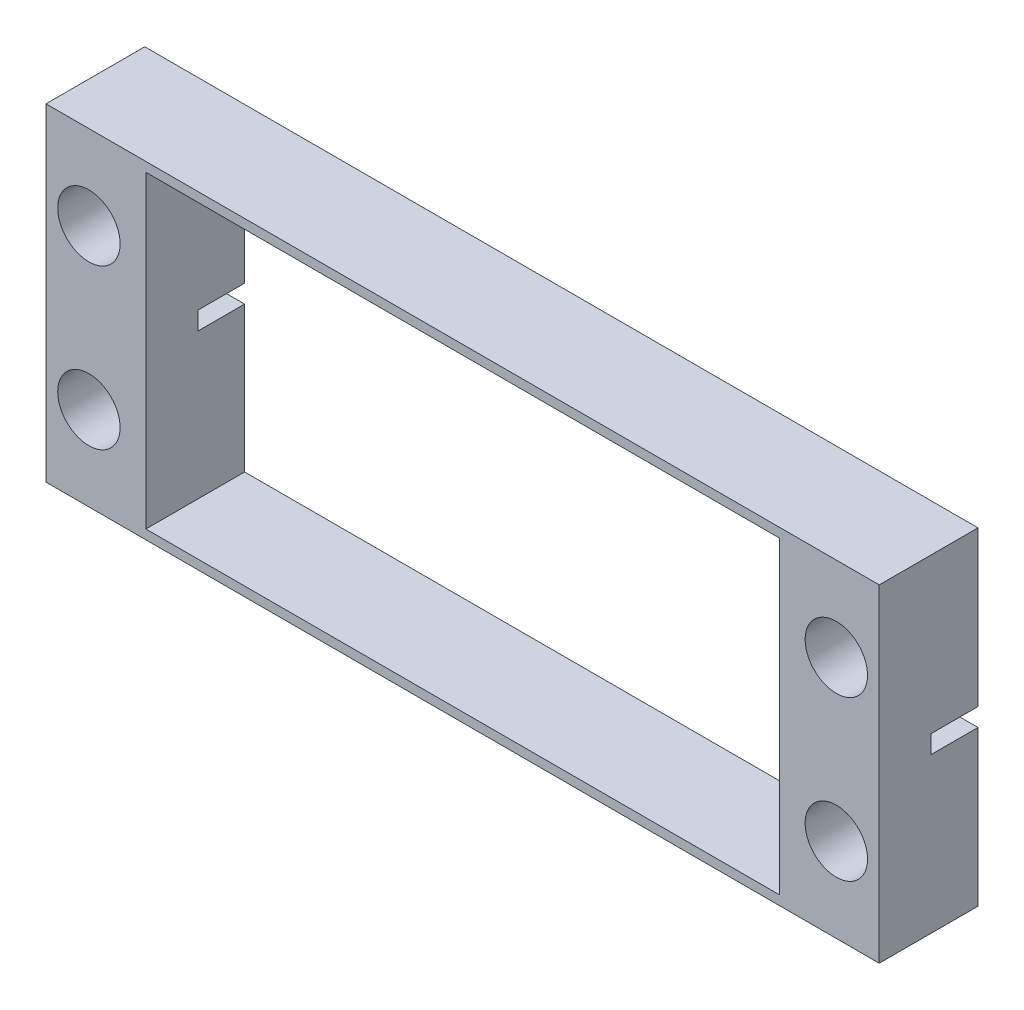
ISO-10303-21;
HEADER;
FILE_DESCRIPTION(('STEP AP214'),'2;1');
FILE_NAME('part.step','',(''),(''),'','','');
FILE_SCHEMA(('AUTOMOTIVE_DESIGN { 1 0 10303 214 1 1 1 1 }'));
ENDSEC;
DATA;
#1=APPLICATION_CONTEXT('core data for automotive mechanical design processes');
#2=APPLICATION_PROTOCOL_DEFINITION('international standard','automotive_design',2000,#1);
#3=PRODUCT_CONTEXT('',#1,'mechanical');
#4=PRODUCT('Part','Part','',(#3));
#5=PRODUCT_RELATED_PRODUCT_CATEGORY('part','',(#4));
#6=PRODUCT_DEFINITION_FORMATION('','',#4);
#7=PRODUCT_DEFINITION_CONTEXT('part definition',#1,'design');
#8=PRODUCT_DEFINITION('design','',#6,#7);
#9=PRODUCT_DEFINITION_SHAPE('','',#8);
#10=(LENGTH_UNIT() NAMED_UNIT(*) SI_UNIT(.MILLI.,.METRE.));
#11=(NAMED_UNIT(*) PLANE_ANGLE_UNIT() SI_UNIT($,.RADIAN.));
#12=(NAMED_UNIT(*) SI_UNIT($,.STERADIAN.) SOLID_ANGLE_UNIT());
#13=UNCERTAINTY_MEASURE_WITH_UNIT(LENGTH_MEASURE(1.E-05),#10,'distance_accuracy_value','');
#14=(GEOMETRIC_REPRESENTATION_CONTEXT(3) GLOBAL_UNCERTAINTY_ASSIGNED_CONTEXT((#13)) GLOBAL_UNIT_ASSIGNED_CONTEXT((#10,
#11,#12)) REPRESENTATION_CONTEXT('',''));
#15=CARTESIAN_POINT('',(0.,0.,0.));
#16=DIRECTION('',(0.,0.,1.));
#17=DIRECTION('',(1.,0.,0.));
#18=AXIS2_PLACEMENT_3D('',#15,#16,#17);
#19=CARTESIAN_POINT('',(0.,0.,0.));
#20=DIRECTION('',(0.,0.,-1.));
#21=DIRECTION('',(-1.,0.,0.));
#22=AXIS2_PLACEMENT_3D('',#19,#20,#21);
#23=PLANE('',#22);
#24=CARTESIAN_POINT('',(23.95,5.1,4.00000007075296E-08));
#25=DIRECTION('',(0.,0.,1.));
#26=DIRECTION('',(-1.,0.,0.));
#27=AXIS2_PLACEMENT_3D('',#24,#25,#26);
#28=CIRCLE('',#27,2.);
#29=CARTESIAN_POINT('',(21.95,5.1,4.00000007075296E-08));
#30=VERTEX_POINT('',#29);
#31=EDGE_CURVE('E496',#30,#30,#28,.T.);
#32=ORIENTED_EDGE('',*,*,#31,.T.);
#33=EDGE_LOOP('',(#32));
#34=FACE_BOUND('',#33,.T.);
#35=CARTESIAN_POINT('',(-23.95,5.1,4.00000007075296E-08));
#36=DIRECTION('',(0.,0.,1.));
#37=DIRECTION('',(1.,0.,0.));
#38=AXIS2_PLACEMENT_3D('',#35,#36,#37);
#39=CIRCLE('',#38,2.);
#40=CARTESIAN_POINT('',(-21.95,5.1,4.00000007075296E-08));
#41=VERTEX_POINT('',#40);
#42=EDGE_CURVE('E302',#41,#41,#39,.T.);
#43=ORIENTED_EDGE('',*,*,#42,.T.);
#44=EDGE_LOOP('',(#43));
#45=FACE_BOUND('',#44,.T.);
#46=DIRECTION('',(-1.,0.,0.));
#47=VECTOR('',#46,1.);
#48=CARTESIAN_POINT('',(26.7,0.58,0.));
#49=LINE('',#48,#47);
#50=CARTESIAN_POINT('',(-20.3,0.58,0.));
#51=VERTEX_POINT('',#50);
#52=CARTESIAN_POINT('',(-26.7,0.58,0.));
#53=VERTEX_POINT('',#52);
#54=EDGE_CURVE('E215',#51,#53,#49,.T.);
#55=ORIENTED_EDGE('',*,*,#54,.T.);
#56=DIRECTION('',(0.,-1.,0.));
#57=VECTOR('',#56,1.);
#58=CARTESIAN_POINT('',(-26.7,-10.5,0.));
#59=LINE('',#58,#57);
#60=CARTESIAN_POINT('',(-26.7,10.5,0.));
#61=VERTEX_POINT('',#60);
#62=EDGE_CURVE('E180',#61,#53,#59,.T.);
#63=ORIENTED_EDGE('',*,*,#62,.F.);
#64=DIRECTION('',(-1.,0.,0.));
#65=VECTOR('',#64,1.);
#66=CARTESIAN_POINT('',(-26.7,10.5,0.));
#67=LINE('',#66,#65);
#68=CARTESIAN_POINT('',(26.7,10.5,0.));
#69=VERTEX_POINT('',#68);
#70=EDGE_CURVE('E170',#69,#61,#67,.T.);
#71=ORIENTED_EDGE('',*,*,#70,.F.);
#72=DIRECTION('',(0.,1.,0.));
#73=VECTOR('',#72,1.);
#74=CARTESIAN_POINT('',(26.7,-10.5,0.));
#75=LINE('',#74,#73);
#76=CARTESIAN_POINT('',(26.7,0.58,0.));
#77=VERTEX_POINT('',#76);
#78=EDGE_CURVE('E171',#77,#69,#75,.T.);
#79=ORIENTED_EDGE('',*,*,#78,.F.);
#80=CARTESIAN_POINT('',(20.3,0.58,0.));
#81=VERTEX_POINT('',#80);
#82=EDGE_CURVE('E218',#77,#81,#49,.T.);
#83=ORIENTED_EDGE('',*,*,#82,.T.);
#84=DIRECTION('',(0.,1.,0.));
#85=VECTOR('',#84,1.);
#86=CARTESIAN_POINT('',(20.3,-9.9,0.));
#87=LINE('',#86,#85);
#88=CARTESIAN_POINT('',(20.3,9.9,0.));
#89=VERTEX_POINT('',#88);
#90=EDGE_CURVE('E232',#81,#89,#87,.T.);
#91=ORIENTED_EDGE('',*,*,#90,.T.);
#92=DIRECTION('',(-1.,0.,0.));
#93=VECTOR('',#92,1.);
#94=CARTESIAN_POINT('',(-20.3,9.9,0.));
#95=LINE('',#94,#93);
#96=CARTESIAN_POINT('',(-20.3,9.9,0.));
#97=VERTEX_POINT('',#96);
#98=EDGE_CURVE('E231',#89,#97,#95,.T.);
#99=ORIENTED_EDGE('',*,*,#98,.T.);
#100=DIRECTION('',(0.,-1.,0.));
#101=VECTOR('',#100,1.);
#102=CARTESIAN_POINT('',(-20.3,-9.9,0.));
#103=LINE('',#102,#101);
#104=EDGE_CURVE('E236',#97,#51,#103,.T.);
#105=ORIENTED_EDGE('',*,*,#104,.T.);
#106=EDGE_LOOP('',(#55,#63,#71,#79,#83,#91,#99,#105));
#107=FACE_BOUND('',#106,.T.);
#108=ADVANCED_FACE('F33',(#34,#45,#107),#23,.T.);
#109=CARTESIAN_POINT('',(26.7,-10.5,6.33000004));
#110=DIRECTION('',(-1.,0.,0.));
#111=DIRECTION('',(0.,0.,1.));
#112=AXIS2_PLACEMENT_3D('',#109,#110,#111);
#113=PLANE('',#112);
#114=DIRECTION('',(0.,1.,0.));
#115=VECTOR('',#114,1.);
#116=CARTESIAN_POINT('',(26.7,0.58,3.));
#117=LINE('',#116,#115);
#118=CARTESIAN_POINT('',(26.7,-0.58,3.));
#119=VERTEX_POINT('',#118);
#120=CARTESIAN_POINT('',(26.7,0.58,3.));
#121=VERTEX_POINT('',#120);
#122=EDGE_CURVE('E152',#119,#121,#117,.T.);
#123=ORIENTED_EDGE('',*,*,#122,.T.);
#124=DIRECTION('',(0.,0.,-1.));
#125=VECTOR('',#124,1.);
#126=CARTESIAN_POINT('',(26.7,0.58,0.));
#127=LINE('',#126,#125);
#128=EDGE_CURVE('E283',#121,#77,#127,.T.);
#129=ORIENTED_EDGE('',*,*,#128,.T.);
#130=ORIENTED_EDGE('',*,*,#78,.T.);
#131=DIRECTION('',(0.,0.,-1.));
#132=VECTOR('',#131,1.);
#133=CARTESIAN_POINT('',(26.7,10.5,6.33000004));
#134=LINE('',#133,#132);
#135=CARTESIAN_POINT('',(26.7,10.5,6.33000004));
#136=VERTEX_POINT('',#135);
#137=EDGE_CURVE('E193',#136,#69,#134,.T.);
#138=ORIENTED_EDGE('',*,*,#137,.F.);
#139=DIRECTION('',(0.,1.,0.));
#140=VECTOR('',#139,1.);
#141=CARTESIAN_POINT('',(26.7,-10.5,6.33000004));
#142=LINE('',#141,#140);
#143=CARTESIAN_POINT('',(26.7,-10.5,6.33000004));
#144=VERTEX_POINT('',#143);
#145=EDGE_CURVE('E185',#144,#136,#142,.T.);
#146=ORIENTED_EDGE('',*,*,#145,.F.);
#147=DIRECTION('',(0.,0.,-1.));
#148=VECTOR('',#147,1.);
#149=CARTESIAN_POINT('',(26.7,-10.5,6.33000004));
#150=LINE('',#149,#148);
#151=CARTESIAN_POINT('',(26.7,-10.5,0.));
#152=VERTEX_POINT('',#151);
#153=EDGE_CURVE('E169',#144,#152,#150,.T.);
#154=ORIENTED_EDGE('',*,*,#153,.T.);
#155=CARTESIAN_POINT('',(26.7,-0.58,0.));
#156=VERTEX_POINT('',#155);
#157=EDGE_CURVE('E160',#152,#156,#75,.T.);
#158=ORIENTED_EDGE('',*,*,#157,.T.);
#159=DIRECTION('',(0.,0.,1.));
#160=VECTOR('',#159,1.);
#161=CARTESIAN_POINT('',(26.7,-0.58,0.));
#162=LINE('',#161,#160);
#163=EDGE_CURVE('E144',#156,#119,#162,.T.);
#164=ORIENTED_EDGE('',*,*,#163,.T.);
#165=EDGE_LOOP('',(#123,#129,#130,#138,#146,#154,#158,#164));
#166=FACE_BOUND('',#165,.T.);
#167=ADVANCED_FACE('F35',(#166),#113,.F.);
#168=CARTESIAN_POINT('',(-26.7,10.5,6.33000004));
#169=DIRECTION('',(0.,-1.,0.));
#170=DIRECTION('',(0.,0.,-1.));
#171=AXIS2_PLACEMENT_3D('',#168,#169,#170);
#172=PLANE('',#171);
#173=ORIENTED_EDGE('',*,*,#70,.T.);
#174=DIRECTION('',(0.,0.,-1.));
#175=VECTOR('',#174,1.);
#176=CARTESIAN_POINT('',(-26.7,10.5,6.33000004));
#177=LINE('',#176,#175);
#178=CARTESIAN_POINT('',(-26.7,10.5,6.33000004));
#179=VERTEX_POINT('',#178);
#180=EDGE_CURVE('E190',#179,#61,#177,.T.);
#181=ORIENTED_EDGE('',*,*,#180,.F.);
#182=DIRECTION('',(-1.,0.,0.));
#183=VECTOR('',#182,1.);
#184=CARTESIAN_POINT('',(-26.7,10.5,6.33000004));
#185=LINE('',#184,#183);
#186=EDGE_CURVE('E260',#136,#179,#185,.T.);
#187=ORIENTED_EDGE('',*,*,#186,.F.);
#188=ORIENTED_EDGE('',*,*,#137,.T.);
#189=EDGE_LOOP('',(#173,#181,#187,#188));
#190=FACE_BOUND('',#189,.T.);
#191=ADVANCED_FACE('F274',(#190),#172,.F.);
#192=CARTESIAN_POINT('',(-26.7,-10.5,6.33000004));
#193=DIRECTION('',(1.,0.,0.));
#194=DIRECTION('',(0.,0.,-1.));
#195=AXIS2_PLACEMENT_3D('',#192,#193,#194);
#196=PLANE('',#195);
#197=ORIENTED_EDGE('',*,*,#62,.T.);
#198=DIRECTION('',(0.,0.,-1.));
#199=VECTOR('',#198,1.);
#200=CARTESIAN_POINT('',(-26.7,0.58,0.));
#201=LINE('',#200,#199);
#202=CARTESIAN_POINT('',(-26.7,0.58,3.));
#203=VERTEX_POINT('',#202);
#204=EDGE_CURVE('E153',#203,#53,#201,.T.);
#205=ORIENTED_EDGE('',*,*,#204,.F.);
#206=DIRECTION('',(0.,1.,0.));
#207=VECTOR('',#206,1.);
#208=CARTESIAN_POINT('',(-26.7,0.58,3.));
#209=LINE('',#208,#207);
#210=CARTESIAN_POINT('',(-26.7,-0.58,3.));
#211=VERTEX_POINT('',#210);
#212=EDGE_CURVE('E209',#211,#203,#209,.T.);
#213=ORIENTED_EDGE('',*,*,#212,.F.);
#214=DIRECTION('',(0.,0.,1.));
#215=VECTOR('',#214,1.);
#216=CARTESIAN_POINT('',(-26.7,-0.58,0.));
#217=LINE('',#216,#215);
#218=CARTESIAN_POINT('',(-26.7,-0.58,0.));
#219=VERTEX_POINT('',#218);
#220=EDGE_CURVE('E300',#219,#211,#217,.T.);
#221=ORIENTED_EDGE('',*,*,#220,.F.);
#222=CARTESIAN_POINT('',(-26.7,-10.5,0.));
#223=VERTEX_POINT('',#222);
#224=EDGE_CURVE('E173',#219,#223,#59,.T.);
#225=ORIENTED_EDGE('',*,*,#224,.T.);
#226=DIRECTION('',(0.,0.,-1.));
#227=VECTOR('',#226,1.);
#228=CARTESIAN_POINT('',(-26.7,-10.5,6.33000004));
#229=LINE('',#228,#227);
#230=CARTESIAN_POINT('',(-26.7,-10.5,6.33000004));
#231=VERTEX_POINT('',#230);
#232=EDGE_CURVE('E187',#231,#223,#229,.T.);
#233=ORIENTED_EDGE('',*,*,#232,.F.);
#234=DIRECTION('',(0.,-1.,0.));
#235=VECTOR('',#234,1.);
#236=CARTESIAN_POINT('',(-26.7,-10.5,6.33000004));
#237=LINE('',#236,#235);
#238=EDGE_CURVE('E261',#179,#231,#237,.T.);
#239=ORIENTED_EDGE('',*,*,#238,.F.);
#240=ORIENTED_EDGE('',*,*,#180,.T.);
#241=EDGE_LOOP('',(#197,#205,#213,#221,#225,#233,#239,#240));
#242=FACE_BOUND('',#241,.T.);
#243=ADVANCED_FACE('F278',(#242),#196,.F.);
#244=CARTESIAN_POINT('',(-26.7,-10.5,6.33000004));
#245=DIRECTION('',(0.,1.,0.));
#246=DIRECTION('',(0.,0.,1.));
#247=AXIS2_PLACEMENT_3D('',#244,#245,#246);
#248=PLANE('',#247);
#249=DIRECTION('',(1.,0.,0.));
#250=VECTOR('',#249,1.);
#251=CARTESIAN_POINT('',(-26.7,-10.5,0.));
#252=LINE('',#251,#250);
#253=EDGE_CURVE('E183',#223,#152,#252,.T.);
#254=ORIENTED_EDGE('',*,*,#253,.T.);
#255=ORIENTED_EDGE('',*,*,#153,.F.);
#256=DIRECTION('',(1.,0.,0.));
#257=VECTOR('',#256,1.);
#258=CARTESIAN_POINT('',(-26.7,-10.5,6.33000004));
#259=LINE('',#258,#257);
#260=EDGE_CURVE('E177',#231,#144,#259,.T.);
#261=ORIENTED_EDGE('',*,*,#260,.F.);
#262=ORIENTED_EDGE('',*,*,#232,.T.);
#263=EDGE_LOOP('',(#254,#255,#261,#262));
#264=FACE_BOUND('',#263,.T.);
#265=ADVANCED_FACE('F269',(#264),#248,.F.);
#266=CARTESIAN_POINT('',(0.,0.,6.33000004));
#267=DIRECTION('',(0.,0.,-1.));
#268=DIRECTION('',(-1.,0.,0.));
#269=AXIS2_PLACEMENT_3D('',#266,#267,#268);
#270=PLANE('',#269);
#271=CARTESIAN_POINT('',(23.95,5.1,6.33000004));
#272=DIRECTION('',(0.,0.,1.));
#273=DIRECTION('',(-1.,0.,0.));
#274=AXIS2_PLACEMENT_3D('',#271,#272,#273);
#275=CIRCLE('',#274,2.);
#276=CARTESIAN_POINT('',(21.95,5.1,6.33000004));
#277=VERTEX_POINT('',#276);
#278=EDGE_CURVE('E498',#277,#277,#275,.T.);
#279=ORIENTED_EDGE('',*,*,#278,.F.);
#280=EDGE_LOOP('',(#279));
#281=FACE_BOUND('',#280,.T.);
#282=CARTESIAN_POINT('',(23.95,-5.1,6.33000004));
#283=DIRECTION('',(0.,0.,1.));
#284=DIRECTION('',(1.,0.,0.));
#285=AXIS2_PLACEMENT_3D('',#282,#283,#284);
#286=CIRCLE('',#285,2.);
#287=CARTESIAN_POINT('',(25.95,-5.1,6.33000004));
#288=VERTEX_POINT('',#287);
#289=EDGE_CURVE('E500',#288,#288,#286,.T.);
#290=ORIENTED_EDGE('',*,*,#289,.F.);
#291=EDGE_LOOP('',(#290));
#292=FACE_BOUND('',#291,.T.);
#293=CARTESIAN_POINT('',(-23.95,-5.1,6.33000004));
#294=DIRECTION('',(0.,0.,1.));
#295=DIRECTION('',(-1.,0.,0.));
#296=AXIS2_PLACEMENT_3D('',#293,#294,#295);
#297=CIRCLE('',#296,2.);
#298=CARTESIAN_POINT('',(-25.95,-5.1,6.33000004));
#299=VERTEX_POINT('',#298);
#300=EDGE_CURVE('E511',#299,#299,#297,.T.);
#301=ORIENTED_EDGE('',*,*,#300,.F.);
#302=EDGE_LOOP('',(#301));
#303=FACE_BOUND('',#302,.T.);
#304=CARTESIAN_POINT('',(-23.95,5.1,6.33000004));
#305=DIRECTION('',(0.,0.,1.));
#306=DIRECTION('',(1.,0.,0.));
#307=AXIS2_PLACEMENT_3D('',#304,#305,#306);
#308=CIRCLE('',#307,2.);
#309=CARTESIAN_POINT('',(-21.95,5.1,6.33000004));
#310=VERTEX_POINT('',#309);
#311=EDGE_CURVE('E505',#310,#310,#308,.T.);
#312=ORIENTED_EDGE('',*,*,#311,.F.);
#313=EDGE_LOOP('',(#312));
#314=FACE_BOUND('',#313,.T.);
#315=DIRECTION('',(-1.,0.,0.));
#316=VECTOR('',#315,1.);
#317=CARTESIAN_POINT('',(-20.3,9.9,6.33000004));
#318=LINE('',#317,#316);
#319=CARTESIAN_POINT('',(20.3,9.9,6.33000004));
#320=VERTEX_POINT('',#319);
#321=CARTESIAN_POINT('',(-20.3,9.9,6.33000004));
#322=VERTEX_POINT('',#321);
#323=EDGE_CURVE('E242',#320,#322,#318,.T.);
#324=ORIENTED_EDGE('',*,*,#323,.F.);
#325=DIRECTION('',(0.,1.,0.));
#326=VECTOR('',#325,1.);
#327=CARTESIAN_POINT('',(20.3,-9.9,6.33000004));
#328=LINE('',#327,#326);
#329=CARTESIAN_POINT('',(20.3,-9.9,6.33000004));
#330=VERTEX_POINT('',#329);
#331=EDGE_CURVE('E229',#330,#320,#328,.T.);
#332=ORIENTED_EDGE('',*,*,#331,.F.);
#333=DIRECTION('',(1.,0.,0.));
#334=VECTOR('',#333,1.);
#335=CARTESIAN_POINT('',(-20.3,-9.9,6.33000004));
#336=LINE('',#335,#334);
#337=CARTESIAN_POINT('',(-20.3,-9.9,6.33000004));
#338=VERTEX_POINT('',#337);
#339=EDGE_CURVE('E248',#338,#330,#336,.T.);
#340=ORIENTED_EDGE('',*,*,#339,.F.);
#341=DIRECTION('',(0.,-1.,0.));
#342=VECTOR('',#341,1.);
#343=CARTESIAN_POINT('',(-20.3,-9.9,6.33000004));
#344=LINE('',#343,#342);
#345=EDGE_CURVE('E245',#322,#338,#344,.T.);
#346=ORIENTED_EDGE('',*,*,#345,.F.);
#347=EDGE_LOOP('',(#324,#332,#340,#346));
#348=FACE_BOUND('',#347,.T.);
#349=ORIENTED_EDGE('',*,*,#145,.T.);
#350=ORIENTED_EDGE('',*,*,#186,.T.);
#351=ORIENTED_EDGE('',*,*,#238,.T.);
#352=ORIENTED_EDGE('',*,*,#260,.T.);
#353=EDGE_LOOP('',(#349,#350,#351,#352));
#354=FACE_BOUND('',#353,.T.);
#355=ADVANCED_FACE('F266',(#281,#292,#303,#314,#348,#354),#270,.F.);
#356=CARTESIAN_POINT('',(23.95,-5.1,4.00000007075296E-08));
#357=DIRECTION('',(0.,0.,1.));
#358=DIRECTION('',(1.,0.,0.));
#359=AXIS2_PLACEMENT_3D('',#356,#357,#358);
#360=CIRCLE('',#359,2.);
#361=CARTESIAN_POINT('',(25.95,-5.1,4.00000007075296E-08));
#362=VERTEX_POINT('',#361);
#363=EDGE_CURVE('E516',#362,#362,#360,.T.);
#364=ORIENTED_EDGE('',*,*,#363,.T.);
#365=EDGE_LOOP('',(#364));
#366=FACE_BOUND('',#365,.T.);
#367=CARTESIAN_POINT('',(-23.95,-5.1,4.00000007075296E-08));
#368=DIRECTION('',(0.,0.,1.));
#369=DIRECTION('',(-1.,0.,0.));
#370=AXIS2_PLACEMENT_3D('',#367,#368,#369);
#371=CIRCLE('',#370,2.);
#372=CARTESIAN_POINT('',(-25.95,-5.1,4.00000007075296E-08));
#373=VERTEX_POINT('',#372);
#374=EDGE_CURVE('E507',#373,#373,#371,.T.);
#375=ORIENTED_EDGE('',*,*,#374,.T.);
#376=EDGE_LOOP('',(#375));
#377=FACE_BOUND('',#376,.T.);
#378=DIRECTION('',(-1.,0.,0.));
#379=VECTOR('',#378,1.);
#380=CARTESIAN_POINT('',(26.7,-0.58,0.));
#381=LINE('',#380,#379);
#382=CARTESIAN_POINT('',(20.3,-0.580000000000004,0.));
#383=VERTEX_POINT('',#382);
#384=EDGE_CURVE('E48',#156,#383,#381,.T.);
#385=ORIENTED_EDGE('',*,*,#384,.F.);
#386=ORIENTED_EDGE('',*,*,#157,.F.);
#387=ORIENTED_EDGE('',*,*,#253,.F.);
#388=ORIENTED_EDGE('',*,*,#224,.F.);
#389=CARTESIAN_POINT('',(-20.3,-0.58,0.));
#390=VERTEX_POINT('',#389);
#391=EDGE_CURVE('E164',#390,#219,#381,.T.);
#392=ORIENTED_EDGE('',*,*,#391,.F.);
#393=CARTESIAN_POINT('',(-20.3,-9.9,0.));
#394=VERTEX_POINT('',#393);
#395=EDGE_CURVE('E235',#390,#394,#103,.T.);
#396=ORIENTED_EDGE('',*,*,#395,.T.);
#397=DIRECTION('',(1.,0.,0.));
#398=VECTOR('',#397,1.);
#399=CARTESIAN_POINT('',(-20.3,-9.9,0.));
#400=LINE('',#399,#398);
#401=CARTESIAN_POINT('',(20.3,-9.9,0.));
#402=VERTEX_POINT('',#401);
#403=EDGE_CURVE('E238',#394,#402,#400,.T.);
#404=ORIENTED_EDGE('',*,*,#403,.T.);
#405=EDGE_CURVE('E163',#402,#383,#87,.T.);
#406=ORIENTED_EDGE('',*,*,#405,.T.);
#407=EDGE_LOOP('',(#385,#386,#387,#388,#392,#396,#404,#406));
#408=FACE_BOUND('',#407,.T.);
#409=ADVANCED_FACE('F158',(#366,#377,#408),#23,.T.);
#410=CARTESIAN_POINT('',(20.3,-9.9,0.));
#411=DIRECTION('',(1.,0.,0.));
#412=DIRECTION('',(0.,0.,-1.));
#413=AXIS2_PLACEMENT_3D('',#410,#411,#412);
#414=PLANE('',#413);
#415=ORIENTED_EDGE('',*,*,#90,.F.);
#416=DIRECTION('',(0.,0.,1.));
#417=VECTOR('',#416,1.);
#418=CARTESIAN_POINT('',(20.3,0.580000000000001,0.));
#419=LINE('',#418,#417);
#420=CARTESIAN_POINT('',(20.3,0.58,3.));
#421=VERTEX_POINT('',#420);
#422=EDGE_CURVE('E226',#81,#421,#419,.T.);
#423=ORIENTED_EDGE('',*,*,#422,.T.);
#424=DIRECTION('',(0.,-1.,0.));
#425=VECTOR('',#424,1.);
#426=CARTESIAN_POINT('',(20.3,-9.9,3.));
#427=LINE('',#426,#425);
#428=CARTESIAN_POINT('',(20.3,-0.58,3.));
#429=VERTEX_POINT('',#428);
#430=EDGE_CURVE('E223',#421,#429,#427,.T.);
#431=ORIENTED_EDGE('',*,*,#430,.T.);
#432=DIRECTION('',(0.,0.,-1.));
#433=VECTOR('',#432,1.);
#434=CARTESIAN_POINT('',(20.3,-0.580000000000001,0.));
#435=LINE('',#434,#433);
#436=EDGE_CURVE('E221',#429,#383,#435,.T.);
#437=ORIENTED_EDGE('',*,*,#436,.T.);
#438=ORIENTED_EDGE('',*,*,#405,.F.);
#439=DIRECTION('',(0.,0.,1.));
#440=VECTOR('',#439,1.);
#441=CARTESIAN_POINT('',(20.3,-9.9,0.));
#442=LINE('',#441,#440);
#443=EDGE_CURVE('E175',#402,#330,#442,.T.);
#444=ORIENTED_EDGE('',*,*,#443,.T.);
#445=ORIENTED_EDGE('',*,*,#331,.T.);
#446=DIRECTION('',(0.,0.,1.));
#447=VECTOR('',#446,1.);
#448=CARTESIAN_POINT('',(20.3,9.9,0.));
#449=LINE('',#448,#447);
#450=EDGE_CURVE('E240',#89,#320,#449,.T.);
#451=ORIENTED_EDGE('',*,*,#450,.F.);
#452=EDGE_LOOP('',(#415,#423,#431,#437,#438,#444,#445,#451));
#453=FACE_BOUND('',#452,.T.);
#454=ADVANCED_FACE('F292',(#453),#414,.F.);
#455=CARTESIAN_POINT('',(-20.3,-9.9,0.));
#456=DIRECTION('',(0.,-1.,0.));
#457=DIRECTION('',(0.,0.,-1.));
#458=AXIS2_PLACEMENT_3D('',#455,#456,#457);
#459=PLANE('',#458);
#460=ORIENTED_EDGE('',*,*,#339,.T.);
#461=ORIENTED_EDGE('',*,*,#443,.F.);
#462=ORIENTED_EDGE('',*,*,#403,.F.);
#463=DIRECTION('',(0.,0.,1.));
#464=VECTOR('',#463,1.);
#465=CARTESIAN_POINT('',(-20.3,-9.9,0.));
#466=LINE('',#465,#464);
#467=EDGE_CURVE('E252',#394,#338,#466,.T.);
#468=ORIENTED_EDGE('',*,*,#467,.T.);
#469=EDGE_LOOP('',(#460,#461,#462,#468));
#470=FACE_BOUND('',#469,.T.);
#471=ADVANCED_FACE('F288',(#470),#459,.F.);
#472=CARTESIAN_POINT('',(-20.3,-9.9,0.));
#473=DIRECTION('',(-1.,0.,0.));
#474=DIRECTION('',(0.,0.,1.));
#475=AXIS2_PLACEMENT_3D('',#472,#473,#474);
#476=PLANE('',#475);
#477=DIRECTION('',(0.,1.,0.));
#478=VECTOR('',#477,1.);
#479=CARTESIAN_POINT('',(-20.3,-9.9,3.));
#480=LINE('',#479,#478);
#481=CARTESIAN_POINT('',(-20.3,-0.580000000000001,3.));
#482=VERTEX_POINT('',#481);
#483=CARTESIAN_POINT('',(-20.3,0.58,3.));
#484=VERTEX_POINT('',#483);
#485=EDGE_CURVE('E41',#482,#484,#480,.T.);
#486=ORIENTED_EDGE('',*,*,#485,.T.);
#487=DIRECTION('',(0.,0.,-1.));
#488=VECTOR('',#487,1.);
#489=CARTESIAN_POINT('',(-20.3,0.580000000000001,0.));
#490=LINE('',#489,#488);
#491=EDGE_CURVE('E11',#484,#51,#490,.T.);
#492=ORIENTED_EDGE('',*,*,#491,.T.);
#493=ORIENTED_EDGE('',*,*,#104,.F.);
#494=DIRECTION('',(0.,0.,1.));
#495=VECTOR('',#494,1.);
#496=CARTESIAN_POINT('',(-20.3,9.9,0.));
#497=LINE('',#496,#495);
#498=EDGE_CURVE('E254',#97,#322,#497,.T.);
#499=ORIENTED_EDGE('',*,*,#498,.T.);
#500=ORIENTED_EDGE('',*,*,#345,.T.);
#501=ORIENTED_EDGE('',*,*,#467,.F.);
#502=ORIENTED_EDGE('',*,*,#395,.F.);
#503=DIRECTION('',(0.,0.,1.));
#504=VECTOR('',#503,1.);
#505=CARTESIAN_POINT('',(-20.3,-0.580000000000001,0.));
#506=LINE('',#505,#504);
#507=EDGE_CURVE('E196',#390,#482,#506,.T.);
#508=ORIENTED_EDGE('',*,*,#507,.T.);
#509=EDGE_LOOP('',(#486,#492,#493,#499,#500,#501,#502,#508));
#510=FACE_BOUND('',#509,.T.);
#511=ADVANCED_FACE('F200',(#510),#476,.F.);
#512=CARTESIAN_POINT('',(-20.3,9.9,0.));
#513=DIRECTION('',(0.,1.,0.));
#514=DIRECTION('',(0.,0.,1.));
#515=AXIS2_PLACEMENT_3D('',#512,#513,#514);
#516=PLANE('',#515);
#517=ORIENTED_EDGE('',*,*,#323,.T.);
#518=ORIENTED_EDGE('',*,*,#498,.F.);
#519=ORIENTED_EDGE('',*,*,#98,.F.);
#520=ORIENTED_EDGE('',*,*,#450,.T.);
#521=EDGE_LOOP('',(#517,#518,#519,#520));
#522=FACE_BOUND('',#521,.T.);
#523=ADVANCED_FACE('F313',(#522),#516,.F.);
#524=CARTESIAN_POINT('',(26.7,-0.58,0.));
#525=DIRECTION('',(0.,-1.,0.));
#526=DIRECTION('',(0.,0.,-1.));
#527=AXIS2_PLACEMENT_3D('',#524,#525,#526);
#528=PLANE('',#527);
#529=ORIENTED_EDGE('',*,*,#391,.T.);
#530=ORIENTED_EDGE('',*,*,#220,.T.);
#531=DIRECTION('',(-1.,0.,0.));
#532=VECTOR('',#531,1.);
#533=CARTESIAN_POINT('',(26.7,-0.58,3.));
#534=LINE('',#533,#532);
#535=EDGE_CURVE('E56',#482,#211,#534,.T.);
#536=ORIENTED_EDGE('',*,*,#535,.F.);
#537=ORIENTED_EDGE('',*,*,#507,.F.);
#538=EDGE_LOOP('',(#529,#530,#536,#537));
#539=FACE_BOUND('',#538,.T.);
#540=ADVANCED_FACE('F372',(#539),#528,.F.);
#541=CARTESIAN_POINT('',(26.7,0.58,3.));
#542=DIRECTION('',(0.,0.,1.));
#543=DIRECTION('',(1.,0.,0.));
#544=AXIS2_PLACEMENT_3D('',#541,#542,#543);
#545=PLANE('',#544);
#546=ORIENTED_EDGE('',*,*,#535,.T.);
#547=ORIENTED_EDGE('',*,*,#212,.T.);
#548=DIRECTION('',(-1.,0.,0.));
#549=VECTOR('',#548,1.);
#550=CARTESIAN_POINT('',(26.7,0.58,3.));
#551=LINE('',#550,#549);
#552=EDGE_CURVE('E207',#484,#203,#551,.T.);
#553=ORIENTED_EDGE('',*,*,#552,.F.);
#554=ORIENTED_EDGE('',*,*,#485,.F.);
#555=EDGE_LOOP('',(#546,#547,#553,#554));
#556=FACE_BOUND('',#555,.T.);
#557=ADVANCED_FACE('F205',(#556),#545,.F.);
#558=CARTESIAN_POINT('',(26.7,0.58,0.));
#559=DIRECTION('',(0.,1.,0.));
#560=DIRECTION('',(0.,0.,1.));
#561=AXIS2_PLACEMENT_3D('',#558,#559,#560);
#562=PLANE('',#561);
#563=ORIENTED_EDGE('',*,*,#552,.T.);
#564=ORIENTED_EDGE('',*,*,#204,.T.);
#565=ORIENTED_EDGE('',*,*,#54,.F.);
#566=ORIENTED_EDGE('',*,*,#491,.F.);
#567=EDGE_LOOP('',(#563,#564,#565,#566));
#568=FACE_BOUND('',#567,.T.);
#569=ADVANCED_FACE('F304',(#568),#562,.F.);
#570=ORIENTED_EDGE('',*,*,#82,.F.);
#571=ORIENTED_EDGE('',*,*,#128,.F.);
#572=EDGE_CURVE('E212',#121,#421,#551,.T.);
#573=ORIENTED_EDGE('',*,*,#572,.T.);
#574=ORIENTED_EDGE('',*,*,#422,.F.);
#575=EDGE_LOOP('',(#570,#571,#573,#574));
#576=FACE_BOUND('',#575,.T.);
#577=ADVANCED_FACE('F404',(#576),#562,.F.);
#578=ORIENTED_EDGE('',*,*,#572,.F.);
#579=ORIENTED_EDGE('',*,*,#122,.F.);
#580=EDGE_CURVE('E147',#119,#429,#534,.T.);
#581=ORIENTED_EDGE('',*,*,#580,.T.);
#582=ORIENTED_EDGE('',*,*,#430,.F.);
#583=EDGE_LOOP('',(#578,#579,#581,#582));
#584=FACE_BOUND('',#583,.T.);
#585=ADVANCED_FACE('F294',(#584),#545,.F.);
#586=ORIENTED_EDGE('',*,*,#580,.F.);
#587=ORIENTED_EDGE('',*,*,#163,.F.);
#588=ORIENTED_EDGE('',*,*,#384,.T.);
#589=ORIENTED_EDGE('',*,*,#436,.F.);
#590=EDGE_LOOP('',(#586,#587,#588,#589));
#591=FACE_BOUND('',#590,.T.);
#592=ADVANCED_FACE('F145',(#591),#528,.F.);
#593=CARTESIAN_POINT('',(-23.95,-5.1,4.00000007075296E-08));
#594=DIRECTION('',(0.,0.,1.));
#595=DIRECTION('',(1.,0.,0.));
#596=AXIS2_PLACEMENT_3D('',#593,#594,#595);
#597=CYLINDRICAL_SURFACE('',#596,2.);
#598=ORIENTED_EDGE('',*,*,#374,.F.);
#599=EDGE_LOOP('',(#598));
#600=FACE_BOUND('',#599,.T.);
#601=ORIENTED_EDGE('',*,*,#300,.T.);
#602=EDGE_LOOP('',(#601));
#603=FACE_BOUND('',#602,.T.);
#604=ADVANCED_FACE('F421',(#600,#603),#597,.F.);
#605=CARTESIAN_POINT('',(23.95,-5.1,4.00000007075296E-08));
#606=DIRECTION('',(0.,0.,1.));
#607=DIRECTION('',(1.,0.,0.));
#608=AXIS2_PLACEMENT_3D('',#605,#606,#607);
#609=CYLINDRICAL_SURFACE('',#608,2.);
#610=ORIENTED_EDGE('',*,*,#363,.F.);
#611=EDGE_LOOP('',(#610));
#612=FACE_BOUND('',#611,.T.);
#613=ORIENTED_EDGE('',*,*,#289,.T.);
#614=EDGE_LOOP('',(#613));
#615=FACE_BOUND('',#614,.T.);
#616=ADVANCED_FACE('F427',(#612,#615),#609,.F.);
#617=CARTESIAN_POINT('',(-23.95,5.1,4.00000007075296E-08));
#618=DIRECTION('',(0.,0.,1.));
#619=DIRECTION('',(1.,0.,0.));
#620=AXIS2_PLACEMENT_3D('',#617,#618,#619);
#621=CYLINDRICAL_SURFACE('',#620,2.);
#622=ORIENTED_EDGE('',*,*,#42,.F.);
#623=EDGE_LOOP('',(#622));
#624=FACE_BOUND('',#623,.T.);
#625=ORIENTED_EDGE('',*,*,#311,.T.);
#626=EDGE_LOOP('',(#625));
#627=FACE_BOUND('',#626,.T.);
#628=ADVANCED_FACE('F436',(#624,#627),#621,.F.);
#629=CARTESIAN_POINT('',(23.95,5.1,4.00000007075296E-08));
#630=DIRECTION('',(0.,0.,1.));
#631=DIRECTION('',(1.,0.,0.));
#632=AXIS2_PLACEMENT_3D('',#629,#630,#631);
#633=CYLINDRICAL_SURFACE('',#632,2.);
#634=ORIENTED_EDGE('',*,*,#31,.F.);
#635=EDGE_LOOP('',(#634));
#636=FACE_BOUND('',#635,.T.);
#637=ORIENTED_EDGE('',*,*,#278,.T.);
#638=EDGE_LOOP('',(#637));
#639=FACE_BOUND('',#638,.T.);
#640=ADVANCED_FACE('F444',(#636,#639),#633,.F.);
#641=CLOSED_SHELL('',(#108,#167,#191,#243,#265,#355,#409,#454,#471,#511,#523,#540,#557,#569,
#577,#585,#592,#604,#616,#628,#640));
#642=MANIFOLD_SOLID_BREP('B2',#641);
#643=ADVANCED_BREP_SHAPE_REPRESENTATION('',(#18,#642),#14);
#644=SHAPE_DEFINITION_REPRESENTATION(#9,#643);
ENDSEC;
END-ISO-10303-21;
